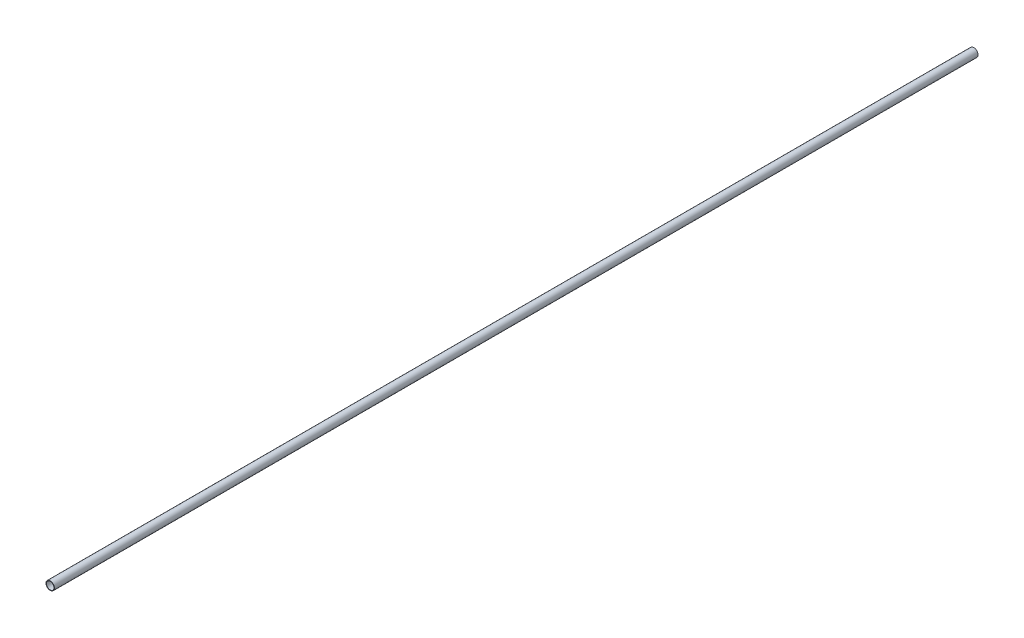
ISO-10303-21;
HEADER;
FILE_DESCRIPTION(('STEP AP214'),'2;1');
FILE_NAME('part.step','',(''),(''),'','','');
FILE_SCHEMA(('AUTOMOTIVE_DESIGN { 1 0 10303 214 1 1 1 1 }'));
ENDSEC;
DATA;
#1=APPLICATION_CONTEXT('core data for automotive mechanical design processes');
#2=APPLICATION_PROTOCOL_DEFINITION('international standard','automotive_design',2000,#1);
#3=PRODUCT_CONTEXT('',#1,'mechanical');
#4=PRODUCT('Part','Part','',(#3));
#5=PRODUCT_RELATED_PRODUCT_CATEGORY('part','',(#4));
#6=PRODUCT_DEFINITION_FORMATION('','',#4);
#7=PRODUCT_DEFINITION_CONTEXT('part definition',#1,'design');
#8=PRODUCT_DEFINITION('design','',#6,#7);
#9=PRODUCT_DEFINITION_SHAPE('','',#8);
#10=(LENGTH_UNIT() NAMED_UNIT(*) SI_UNIT(.MILLI.,.METRE.));
#11=(NAMED_UNIT(*) PLANE_ANGLE_UNIT() SI_UNIT($,.RADIAN.));
#12=(NAMED_UNIT(*) SI_UNIT($,.STERADIAN.) SOLID_ANGLE_UNIT());
#13=UNCERTAINTY_MEASURE_WITH_UNIT(LENGTH_MEASURE(1.E-05),#10,'distance_accuracy_value','');
#14=(GEOMETRIC_REPRESENTATION_CONTEXT(3) GLOBAL_UNCERTAINTY_ASSIGNED_CONTEXT((#13)) GLOBAL_UNIT_ASSIGNED_CONTEXT((#10,
#11,#12)) REPRESENTATION_CONTEXT('',''));
#15=CARTESIAN_POINT('',(0.,0.,0.));
#16=DIRECTION('',(0.,0.,1.));
#17=DIRECTION('',(1.,0.,0.));
#18=AXIS2_PLACEMENT_3D('',#15,#16,#17);
#19=CARTESIAN_POINT('',(0.,0.,2440.));
#20=DIRECTION('',(0.,0.,1.));
#21=DIRECTION('',(1.,0.,0.));
#22=AXIS2_PLACEMENT_3D('',#19,#20,#21);
#23=PLANE('',#22);
#24=CARTESIAN_POINT('',(0.,0.,2440.));
#25=DIRECTION('',(0.,0.,1.));
#26=DIRECTION('',(1.,0.,0.));
#27=AXIS2_PLACEMENT_3D('',#24,#25,#26);
#28=CIRCLE('',#27,11.1);
#29=CARTESIAN_POINT('',(11.1,0.,2440.));
#30=VERTEX_POINT('',#29);
#31=EDGE_CURVE('E10',#30,#30,#28,.T.);
#32=ORIENTED_EDGE('',*,*,#31,.T.);
#33=EDGE_LOOP('',(#32));
#34=FACE_BOUND('',#33,.T.);
#35=CARTESIAN_POINT('',(0.,0.,2440.));
#36=DIRECTION('',(0.,0.,1.));
#37=DIRECTION('',(1.,0.,0.));
#38=AXIS2_PLACEMENT_3D('',#35,#36,#37);
#39=CIRCLE('',#38,9.95);
#40=CARTESIAN_POINT('',(9.95,0.,2440.));
#41=VERTEX_POINT('',#40);
#42=EDGE_CURVE('E46',#41,#41,#39,.T.);
#43=ORIENTED_EDGE('',*,*,#42,.F.);
#44=EDGE_LOOP('',(#43));
#45=FACE_BOUND('',#44,.T.);
#46=ADVANCED_FACE('F35',(#34,#45),#23,.T.);
#47=CARTESIAN_POINT('',(0.,0.,0.));
#48=DIRECTION('',(0.,0.,1.));
#49=DIRECTION('',(1.,0.,0.));
#50=AXIS2_PLACEMENT_3D('',#47,#48,#49);
#51=PLANE('',#50);
#52=CARTESIAN_POINT('',(0.,0.,0.));
#53=DIRECTION('',(0.,0.,1.));
#54=DIRECTION('',(1.,0.,0.));
#55=AXIS2_PLACEMENT_3D('',#52,#53,#54);
#56=CIRCLE('',#55,11.1);
#57=CARTESIAN_POINT('',(11.1,0.,0.));
#58=VERTEX_POINT('',#57);
#59=EDGE_CURVE('E39',#58,#58,#56,.T.);
#60=ORIENTED_EDGE('',*,*,#59,.F.);
#61=EDGE_LOOP('',(#60));
#62=FACE_BOUND('',#61,.T.);
#63=CARTESIAN_POINT('',(0.,0.,0.));
#64=DIRECTION('',(0.,0.,1.));
#65=DIRECTION('',(1.,0.,0.));
#66=AXIS2_PLACEMENT_3D('',#63,#64,#65);
#67=CIRCLE('',#66,9.95);
#68=CARTESIAN_POINT('',(9.95,0.,0.));
#69=VERTEX_POINT('',#68);
#70=EDGE_CURVE('E48',#69,#69,#67,.T.);
#71=ORIENTED_EDGE('',*,*,#70,.T.);
#72=EDGE_LOOP('',(#71));
#73=FACE_BOUND('',#72,.T.);
#74=ADVANCED_FACE('F58',(#62,#73),#51,.F.);
#75=CARTESIAN_POINT('',(0.,0.,2440.));
#76=DIRECTION('',(0.,0.,-1.));
#77=DIRECTION('',(-1.,0.,0.));
#78=AXIS2_PLACEMENT_3D('',#75,#76,#77);
#79=CYLINDRICAL_SURFACE('',#78,11.1);
#80=ORIENTED_EDGE('',*,*,#31,.F.);
#81=EDGE_LOOP('',(#80));
#82=FACE_BOUND('',#81,.T.);
#83=ORIENTED_EDGE('',*,*,#59,.T.);
#84=EDGE_LOOP('',(#83));
#85=FACE_BOUND('',#84,.T.);
#86=ADVANCED_FACE('F37',(#82,#85),#79,.T.);
#87=CARTESIAN_POINT('',(0.,0.,2440.));
#88=DIRECTION('',(0.,0.,-1.));
#89=DIRECTION('',(-1.,0.,0.));
#90=AXIS2_PLACEMENT_3D('',#87,#88,#89);
#91=CYLINDRICAL_SURFACE('',#90,9.95);
#92=ORIENTED_EDGE('',*,*,#42,.T.);
#93=EDGE_LOOP('',(#92));
#94=FACE_BOUND('',#93,.T.);
#95=ORIENTED_EDGE('',*,*,#70,.F.);
#96=EDGE_LOOP('',(#95));
#97=FACE_BOUND('',#96,.T.);
#98=ADVANCED_FACE('F54',(#94,#97),#91,.F.);
#99=CLOSED_SHELL('',(#46,#74,#86,#98));
#100=MANIFOLD_SOLID_BREP('B2',#99);
#101=ADVANCED_BREP_SHAPE_REPRESENTATION('',(#18,#100),#14);
#102=SHAPE_DEFINITION_REPRESENTATION(#9,#101);
ENDSEC;
END-ISO-10303-21;
